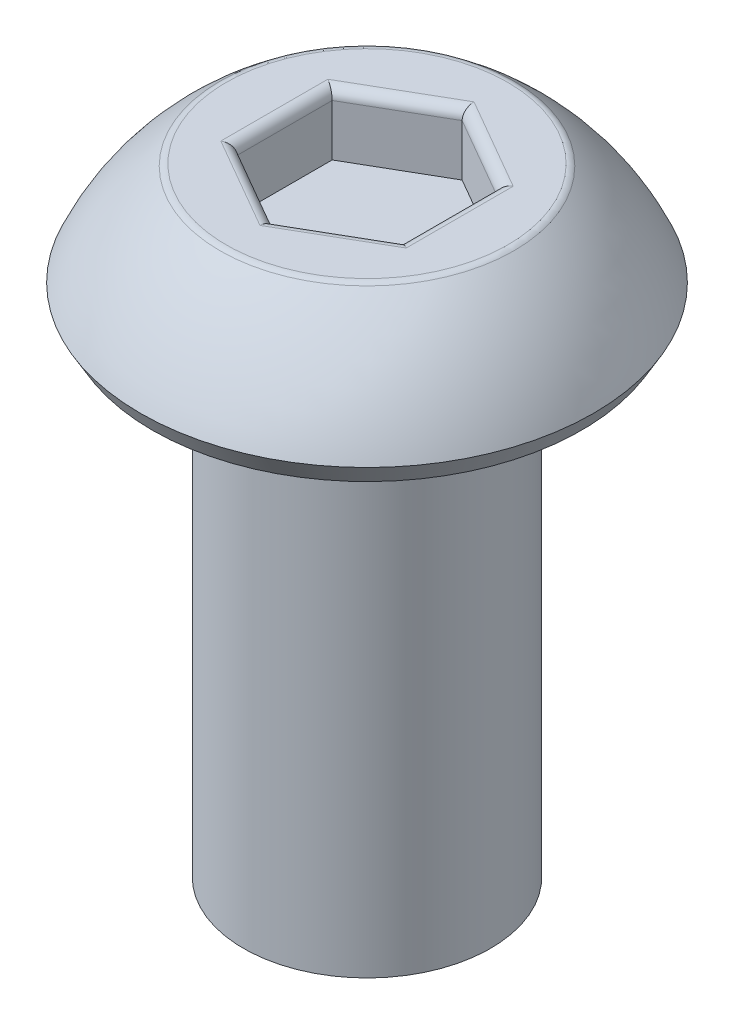
ISO-10303-21;
HEADER;
FILE_DESCRIPTION(('STEP AP214'),'2;1');
FILE_NAME('part.step','',(''),(''),'','','');
FILE_SCHEMA(('AUTOMOTIVE_DESIGN { 1 0 10303 214 1 1 1 1 }'));
ENDSEC;
DATA;
#1=APPLICATION_CONTEXT('core data for automotive mechanical design processes');
#2=APPLICATION_PROTOCOL_DEFINITION('international standard','automotive_design',2000,#1);
#3=PRODUCT_CONTEXT('',#1,'mechanical');
#4=PRODUCT('Part','Part','',(#3));
#5=PRODUCT_RELATED_PRODUCT_CATEGORY('part','',(#4));
#6=PRODUCT_DEFINITION_FORMATION('','',#4);
#7=PRODUCT_DEFINITION_CONTEXT('part definition',#1,'design');
#8=PRODUCT_DEFINITION('design','',#6,#7);
#9=PRODUCT_DEFINITION_SHAPE('','',#8);
#10=(LENGTH_UNIT() NAMED_UNIT(*) SI_UNIT(.MILLI.,.METRE.));
#11=(NAMED_UNIT(*) PLANE_ANGLE_UNIT() SI_UNIT($,.RADIAN.));
#12=(NAMED_UNIT(*) SI_UNIT($,.STERADIAN.) SOLID_ANGLE_UNIT());
#13=UNCERTAINTY_MEASURE_WITH_UNIT(LENGTH_MEASURE(1.E-05),#10,'distance_accuracy_value','');
#14=(GEOMETRIC_REPRESENTATION_CONTEXT(3) GLOBAL_UNCERTAINTY_ASSIGNED_CONTEXT((#13)) GLOBAL_UNIT_ASSIGNED_CONTEXT((#10,
#11,#12)) REPRESENTATION_CONTEXT('',''));
#15=CARTESIAN_POINT('',(0.,0.,0.));
#16=DIRECTION('',(0.,0.,1.));
#17=DIRECTION('',(1.,0.,0.));
#18=AXIS2_PLACEMENT_3D('',#15,#16,#17);
#19=CARTESIAN_POINT('',(0.,1.5,0.));
#20=DIRECTION('',(0.,-1.,0.));
#21=DIRECTION('',(0.,0.,-1.));
#22=AXIS2_PLACEMENT_3D('',#19,#20,#21);
#23=PLANE('',#22);
#24=CARTESIAN_POINT('',(0.,1.5,0.));
#25=DIRECTION('',(0.,-1.,0.));
#26=DIRECTION('',(0.,0.,-1.));
#27=AXIS2_PLACEMENT_3D('',#24,#25,#26);
#28=CIRCLE('',#27,1.70906948191647);
#29=CARTESIAN_POINT('',(0.,1.5,-1.70906948191647));
#30=VERTEX_POINT('',#29);
#31=EDGE_CURVE('E179',#30,#30,#28,.F.);
#32=ORIENTED_EDGE('',*,*,#31,.T.);
#33=EDGE_LOOP('',(#32));
#34=FACE_BOUND('',#33,.T.);
#35=DIRECTION('',(0.866025403784439,0.,-0.5));
#36=VECTOR('',#35,1.);
#37=CARTESIAN_POINT('',(0.5625,1.5,0.974278579257493));
#38=LINE('',#37,#36);
#39=CARTESIAN_POINT('',(1.125,1.5,0.649519052838329));
#40=VERTEX_POINT('',#39);
#41=CARTESIAN_POINT('',(0.,1.5,1.29903810567666));
#42=VERTEX_POINT('',#41);
#43=EDGE_CURVE('E174',#40,#42,#38,.F.);
#44=ORIENTED_EDGE('',*,*,#43,.T.);
#45=DIRECTION('',(0.866025403784439,0.,0.5));
#46=VECTOR('',#45,1.);
#47=CARTESIAN_POINT('',(-0.5625,1.5,0.974278579257493));
#48=LINE('',#47,#46);
#49=CARTESIAN_POINT('',(-1.125,1.5,0.649519052838329));
#50=VERTEX_POINT('',#49);
#51=EDGE_CURVE('E176',#42,#50,#48,.F.);
#52=ORIENTED_EDGE('',*,*,#51,.T.);
#53=DIRECTION('',(0.,0.,1.));
#54=VECTOR('',#53,1.);
#55=CARTESIAN_POINT('',(-1.125,1.5,0.));
#56=LINE('',#55,#54);
#57=CARTESIAN_POINT('',(-1.125,1.5,-0.649519052838329));
#58=VERTEX_POINT('',#57);
#59=EDGE_CURVE('E166',#50,#58,#56,.F.);
#60=ORIENTED_EDGE('',*,*,#59,.T.);
#61=DIRECTION('',(-0.866025403784439,0.,0.5));
#62=VECTOR('',#61,1.);
#63=CARTESIAN_POINT('',(-0.5625,1.5,-0.974278579257493));
#64=LINE('',#63,#62);
#65=CARTESIAN_POINT('',(0.,1.5,-1.29903810567666));
#66=VERTEX_POINT('',#65);
#67=EDGE_CURVE('E168',#58,#66,#64,.F.);
#68=ORIENTED_EDGE('',*,*,#67,.T.);
#69=DIRECTION('',(-0.866025403784439,0.,-0.5));
#70=VECTOR('',#69,1.);
#71=CARTESIAN_POINT('',(0.5625,1.5,-0.974278579257494));
#72=LINE('',#71,#70);
#73=CARTESIAN_POINT('',(1.125,1.5,-0.64951905283833));
#74=VERTEX_POINT('',#73);
#75=EDGE_CURVE('E170',#66,#74,#72,.F.);
#76=ORIENTED_EDGE('',*,*,#75,.T.);
#77=DIRECTION('',(0.,0.,-1.));
#78=VECTOR('',#77,1.);
#79=CARTESIAN_POINT('',(1.125,1.5,0.));
#80=LINE('',#79,#78);
#81=EDGE_CURVE('E172',#74,#40,#80,.F.);
#82=ORIENTED_EDGE('',*,*,#81,.T.);
#83=EDGE_LOOP('',(#44,#52,#60,#68,#76,#82));
#84=FACE_BOUND('',#83,.T.);
#85=ADVANCED_FACE('F37',(#34,#84),#23,.F.);
#86=CARTESIAN_POINT('',(0.,-0.931154789034212,0.));
#87=DIRECTION('',(0.,-1.,0.));
#88=DIRECTION('',(0.,0.,-1.));
#89=AXIS2_PLACEMENT_3D('',#86,#87,#88);
#90=DEGENERATE_TOROIDAL_SURFACE('',#89,0.00769348629276519,3.,.F.);
#91=CARTESIAN_POINT('',(0.,1.47526759952323,0.));
#92=DIRECTION('',(0.,-1.,0.));
#93=DIRECTION('',(0.,0.,-1.));
#94=AXIS2_PLACEMENT_3D('',#91,#92,#93);
#95=CIRCLE('',#94,1.78371135009948);
#96=CARTESIAN_POINT('',(0.,1.47526759952323,-1.78371135009948));
#97=VERTEX_POINT('',#96);
#98=EDGE_CURVE('E163',#97,#97,#95,.T.);
#99=ORIENTED_EDGE('',*,*,#98,.T.);
#100=EDGE_LOOP('',(#99));
#101=FACE_BOUND('',#100,.T.);
#102=CARTESIAN_POINT('',(0.,0.25,0.));
#103=DIRECTION('',(0.,-1.,0.));
#104=DIRECTION('',(0.,0.,-1.));
#105=AXIS2_PLACEMENT_3D('',#102,#103,#104);
#106=CIRCLE('',#105,2.75);
#107=CARTESIAN_POINT('',(0.,0.25,-2.75));
#108=VERTEX_POINT('',#107);
#109=EDGE_CURVE('E160',#108,#108,#106,.T.);
#110=ORIENTED_EDGE('',*,*,#109,.F.);
#111=EDGE_LOOP('',(#110));
#112=FACE_BOUND('',#111,.T.);
#113=ADVANCED_FACE('F246',(#101,#112),#90,.F.);
#114=CARTESIAN_POINT('',(0.,0.25,0.));
#115=DIRECTION('',(0.,1.,0.));
#116=DIRECTION('',(0.,0.,1.));
#117=AXIS2_PLACEMENT_3D('',#114,#115,#116);
#118=CONICAL_SURFACE('',#117,2.75,0.523598775598296);
#119=CARTESIAN_POINT('',(0.,0.,0.));
#120=DIRECTION('',(0.,-1.,0.));
#121=DIRECTION('',(0.,0.,-1.));
#122=AXIS2_PLACEMENT_3D('',#119,#120,#121);
#123=CIRCLE('',#122,2.60566243270259);
#124=CARTESIAN_POINT('',(0.,0.,-2.60566243270259));
#125=VERTEX_POINT('',#124);
#126=EDGE_CURVE('E157',#125,#125,#123,.T.);
#127=ORIENTED_EDGE('',*,*,#126,.F.);
#128=EDGE_LOOP('',(#127));
#129=FACE_BOUND('',#128,.T.);
#130=ORIENTED_EDGE('',*,*,#109,.T.);
#131=EDGE_LOOP('',(#130));
#132=FACE_BOUND('',#131,.T.);
#133=ADVANCED_FACE('F252',(#129,#132),#118,.T.);
#134=CARTESIAN_POINT('',(0.,0.,2.60566243270259));
#135=DIRECTION('',(0.,1.,0.));
#136=DIRECTION('',(0.,0.,1.));
#137=AXIS2_PLACEMENT_3D('',#134,#135,#136);
#138=PLANE('',#137);
#139=CARTESIAN_POINT('',(0.,0.,0.));
#140=DIRECTION('',(0.,-1.,0.));
#141=DIRECTION('',(0.,0.,-1.));
#142=AXIS2_PLACEMENT_3D('',#139,#140,#141);
#143=CIRCLE('',#142,1.5);
#144=CARTESIAN_POINT('',(0.,0.,-1.5));
#145=VERTEX_POINT('',#144);
#146=EDGE_CURVE('E154',#145,#145,#143,.T.);
#147=ORIENTED_EDGE('',*,*,#146,.F.);
#148=EDGE_LOOP('',(#147));
#149=FACE_BOUND('',#148,.T.);
#150=ORIENTED_EDGE('',*,*,#126,.T.);
#151=EDGE_LOOP('',(#150));
#152=FACE_BOUND('',#151,.T.);
#153=ADVANCED_FACE('F271',(#149,#152),#138,.F.);
#154=CARTESIAN_POINT('',(0.,-6.,0.));
#155=DIRECTION('',(0.,-1.,0.));
#156=DIRECTION('',(0.,0.,-1.));
#157=AXIS2_PLACEMENT_3D('',#154,#155,#156);
#158=CYLINDRICAL_SURFACE('',#157,1.5);
#159=CARTESIAN_POINT('',(0.,-6.,0.));
#160=DIRECTION('',(0.,-1.,0.));
#161=DIRECTION('',(0.,0.,-1.));
#162=AXIS2_PLACEMENT_3D('',#159,#160,#161);
#163=CIRCLE('',#162,1.5);
#164=CARTESIAN_POINT('',(0.,-6.,-1.5));
#165=VERTEX_POINT('',#164);
#166=EDGE_CURVE('E141',#165,#165,#163,.T.);
#167=ORIENTED_EDGE('',*,*,#166,.F.);
#168=EDGE_LOOP('',(#167));
#169=FACE_BOUND('',#168,.T.);
#170=ORIENTED_EDGE('',*,*,#146,.T.);
#171=EDGE_LOOP('',(#170));
#172=FACE_BOUND('',#171,.T.);
#173=ADVANCED_FACE('F276',(#169,#172),#158,.T.);
#174=CARTESIAN_POINT('',(0.,-6.,1.5));
#175=DIRECTION('',(0.,1.,0.));
#176=DIRECTION('',(0.,0.,1.));
#177=AXIS2_PLACEMENT_3D('',#174,#175,#176);
#178=PLANE('',#177);
#179=ORIENTED_EDGE('',*,*,#166,.T.);
#180=EDGE_LOOP('',(#179));
#181=FACE_BOUND('',#180,.T.);
#182=ADVANCED_FACE('F283',(#181),#178,.F.);
#183=CARTESIAN_POINT('',(0.999999999999999,0.75,-0.577350269189626));
#184=DIRECTION('',(0.5,0.,-0.866025403784439));
#185=DIRECTION('',(-0.866025403784439,0.,-0.5));
#186=AXIS2_PLACEMENT_3D('',#183,#184,#185);
#187=PLANE('',#186);
#188=DIRECTION('',(0.,1.,0.));
#189=VECTOR('',#188,1.);
#190=CARTESIAN_POINT('',(0.999999999999999,0.75,-0.577350269189626));
#191=LINE('',#190,#189);
#192=CARTESIAN_POINT('',(0.999999999999999,0.75,-0.577350269189626));
#193=VERTEX_POINT('',#192);
#194=CARTESIAN_POINT('',(0.999999999999999,1.375,-0.577350269189626));
#195=VERTEX_POINT('',#194);
#196=EDGE_CURVE('E139',#193,#195,#191,.T.);
#197=ORIENTED_EDGE('',*,*,#196,.T.);
#198=DIRECTION('',(-0.866025403784439,0.,-0.5));
#199=VECTOR('',#198,1.);
#200=CARTESIAN_POINT('',(0.999999999999999,1.375,-0.577350269189626));
#201=LINE('',#200,#199);
#202=CARTESIAN_POINT('',(0.,1.375,-1.15470053837925));
#203=VERTEX_POINT('',#202);
#204=EDGE_CURVE('E61',#195,#203,#201,.T.);
#205=ORIENTED_EDGE('',*,*,#204,.T.);
#206=DIRECTION('',(0.,1.,0.));
#207=VECTOR('',#206,1.);
#208=CARTESIAN_POINT('',(0.,0.75,-1.15470053837925));
#209=LINE('',#208,#207);
#210=CARTESIAN_POINT('',(0.,0.75,-1.15470053837925));
#211=VERTEX_POINT('',#210);
#212=EDGE_CURVE('E107',#211,#203,#209,.T.);
#213=ORIENTED_EDGE('',*,*,#212,.F.);
#214=DIRECTION('',(-0.866025403784439,0.,-0.5));
#215=VECTOR('',#214,1.);
#216=CARTESIAN_POINT('',(0.999999999999999,0.75,-0.577350269189626));
#217=LINE('',#216,#215);
#218=EDGE_CURVE('E111',#193,#211,#217,.T.);
#219=ORIENTED_EDGE('',*,*,#218,.F.);
#220=EDGE_LOOP('',(#197,#205,#213,#219));
#221=FACE_BOUND('',#220,.T.);
#222=ADVANCED_FACE('F109',(#221),#187,.F.);
#223=CARTESIAN_POINT('',(1.,0.75,0.577350269189626));
#224=DIRECTION('',(1.,0.,0.));
#225=DIRECTION('',(0.,0.,-1.));
#226=AXIS2_PLACEMENT_3D('',#223,#224,#225);
#227=PLANE('',#226);
#228=DIRECTION('',(0.,1.,0.));
#229=VECTOR('',#228,1.);
#230=CARTESIAN_POINT('',(1.,0.75,0.577350269189626));
#231=LINE('',#230,#229);
#232=CARTESIAN_POINT('',(1.,0.75,0.577350269189626));
#233=VERTEX_POINT('',#232);
#234=CARTESIAN_POINT('',(1.,1.375,0.577350269189626));
#235=VERTEX_POINT('',#234);
#236=EDGE_CURVE('E142',#233,#235,#231,.T.);
#237=ORIENTED_EDGE('',*,*,#236,.T.);
#238=DIRECTION('',(0.,0.,-1.));
#239=VECTOR('',#238,1.);
#240=CARTESIAN_POINT('',(1.,1.375,0.577350269189626));
#241=LINE('',#240,#239);
#242=EDGE_CURVE('E187',#235,#195,#241,.T.);
#243=ORIENTED_EDGE('',*,*,#242,.T.);
#244=ORIENTED_EDGE('',*,*,#196,.F.);
#245=DIRECTION('',(0.,0.,-1.));
#246=VECTOR('',#245,1.);
#247=CARTESIAN_POINT('',(1.,0.75,0.577350269189626));
#248=LINE('',#247,#246);
#249=EDGE_CURVE('E115',#233,#193,#248,.T.);
#250=ORIENTED_EDGE('',*,*,#249,.F.);
#251=EDGE_LOOP('',(#237,#243,#244,#250));
#252=FACE_BOUND('',#251,.T.);
#253=ADVANCED_FACE('F227',(#252),#227,.F.);
#254=CARTESIAN_POINT('',(0.,0.75,1.15470053837925));
#255=DIRECTION('',(0.5,0.,0.866025403784439));
#256=DIRECTION('',(0.866025403784439,0.,-0.5));
#257=AXIS2_PLACEMENT_3D('',#254,#255,#256);
#258=PLANE('',#257);
#259=DIRECTION('',(0.,1.,0.));
#260=VECTOR('',#259,1.);
#261=CARTESIAN_POINT('',(0.,0.75,1.15470053837925));
#262=LINE('',#261,#260);
#263=CARTESIAN_POINT('',(0.,0.75,1.15470053837925));
#264=VERTEX_POINT('',#263);
#265=CARTESIAN_POINT('',(0.,1.375,1.15470053837925));
#266=VERTEX_POINT('',#265);
#267=EDGE_CURVE('E145',#264,#266,#262,.T.);
#268=ORIENTED_EDGE('',*,*,#267,.T.);
#269=DIRECTION('',(0.866025403784439,0.,-0.5));
#270=VECTOR('',#269,1.);
#271=CARTESIAN_POINT('',(0.,1.375,1.15470053837925));
#272=LINE('',#271,#270);
#273=EDGE_CURVE('E185',#266,#235,#272,.T.);
#274=ORIENTED_EDGE('',*,*,#273,.T.);
#275=ORIENTED_EDGE('',*,*,#236,.F.);
#276=DIRECTION('',(0.866025403784439,0.,-0.5));
#277=VECTOR('',#276,1.);
#278=CARTESIAN_POINT('',(0.,0.75,1.15470053837925));
#279=LINE('',#278,#277);
#280=EDGE_CURVE('E136',#264,#233,#279,.T.);
#281=ORIENTED_EDGE('',*,*,#280,.F.);
#282=EDGE_LOOP('',(#268,#274,#275,#281));
#283=FACE_BOUND('',#282,.T.);
#284=ADVANCED_FACE('F228',(#283),#258,.F.);
#285=CARTESIAN_POINT('',(-0.999999999999999,0.75,0.577350269189626));
#286=DIRECTION('',(-0.5,0.,0.866025403784439));
#287=DIRECTION('',(0.866025403784439,0.,0.5));
#288=AXIS2_PLACEMENT_3D('',#285,#286,#287);
#289=PLANE('',#288);
#290=DIRECTION('',(0.,1.,0.));
#291=VECTOR('',#290,1.);
#292=CARTESIAN_POINT('',(-0.999999999999999,0.75,0.577350269189626));
#293=LINE('',#292,#291);
#294=CARTESIAN_POINT('',(-0.999999999999999,0.75,0.577350269189626));
#295=VERTEX_POINT('',#294);
#296=CARTESIAN_POINT('',(-0.999999999999999,1.375,0.577350269189626));
#297=VERTEX_POINT('',#296);
#298=EDGE_CURVE('E148',#295,#297,#293,.T.);
#299=ORIENTED_EDGE('',*,*,#298,.T.);
#300=DIRECTION('',(0.866025403784439,0.,0.5));
#301=VECTOR('',#300,1.);
#302=CARTESIAN_POINT('',(-0.999999999999999,1.375,0.577350269189626));
#303=LINE('',#302,#301);
#304=EDGE_CURVE('E182',#297,#266,#303,.T.);
#305=ORIENTED_EDGE('',*,*,#304,.T.);
#306=ORIENTED_EDGE('',*,*,#267,.F.);
#307=DIRECTION('',(0.866025403784439,0.,0.5));
#308=VECTOR('',#307,1.);
#309=CARTESIAN_POINT('',(-0.999999999999999,0.75,0.577350269189626));
#310=LINE('',#309,#308);
#311=EDGE_CURVE('E133',#295,#264,#310,.T.);
#312=ORIENTED_EDGE('',*,*,#311,.F.);
#313=EDGE_LOOP('',(#299,#305,#306,#312));
#314=FACE_BOUND('',#313,.T.);
#315=ADVANCED_FACE('F223',(#314),#289,.F.);
#316=CARTESIAN_POINT('',(-1.,0.75,-0.577350269189626));
#317=DIRECTION('',(-1.,0.,0.));
#318=DIRECTION('',(0.,0.,1.));
#319=AXIS2_PLACEMENT_3D('',#316,#317,#318);
#320=PLANE('',#319);
#321=DIRECTION('',(0.,1.,0.));
#322=VECTOR('',#321,1.);
#323=CARTESIAN_POINT('',(-1.,0.75,-0.577350269189626));
#324=LINE('',#323,#322);
#325=CARTESIAN_POINT('',(-1.,0.75,-0.577350269189626));
#326=VERTEX_POINT('',#325);
#327=CARTESIAN_POINT('',(-1.,1.375,-0.577350269189626));
#328=VERTEX_POINT('',#327);
#329=EDGE_CURVE('E114',#326,#328,#324,.T.);
#330=ORIENTED_EDGE('',*,*,#329,.T.);
#331=DIRECTION('',(0.,0.,1.));
#332=VECTOR('',#331,1.);
#333=CARTESIAN_POINT('',(-1.,1.375,-0.577350269189626));
#334=LINE('',#333,#332);
#335=EDGE_CURVE('E11',#328,#297,#334,.T.);
#336=ORIENTED_EDGE('',*,*,#335,.T.);
#337=ORIENTED_EDGE('',*,*,#298,.F.);
#338=DIRECTION('',(0.,0.,1.));
#339=VECTOR('',#338,1.);
#340=CARTESIAN_POINT('',(-1.,0.75,-0.577350269189626));
#341=LINE('',#340,#339);
#342=EDGE_CURVE('E123',#326,#295,#341,.T.);
#343=ORIENTED_EDGE('',*,*,#342,.F.);
#344=EDGE_LOOP('',(#330,#336,#337,#343));
#345=FACE_BOUND('',#344,.T.);
#346=ADVANCED_FACE('F220',(#345),#320,.F.);
#347=CARTESIAN_POINT('',(0.,0.75,-1.15470053837925));
#348=DIRECTION('',(-0.5,0.,-0.866025403784438));
#349=DIRECTION('',(-0.866025403784439,0.,0.5));
#350=AXIS2_PLACEMENT_3D('',#347,#348,#349);
#351=PLANE('',#350);
#352=ORIENTED_EDGE('',*,*,#212,.T.);
#353=DIRECTION('',(-0.866025403784439,0.,0.5));
#354=VECTOR('',#353,1.);
#355=CARTESIAN_POINT('',(0.,1.375,-1.15470053837925));
#356=LINE('',#355,#354);
#357=EDGE_CURVE('E46',#203,#328,#356,.T.);
#358=ORIENTED_EDGE('',*,*,#357,.T.);
#359=ORIENTED_EDGE('',*,*,#329,.F.);
#360=DIRECTION('',(-0.866025403784439,0.,0.5));
#361=VECTOR('',#360,1.);
#362=CARTESIAN_POINT('',(0.,0.75,-1.15470053837925));
#363=LINE('',#362,#361);
#364=EDGE_CURVE('E118',#211,#326,#363,.T.);
#365=ORIENTED_EDGE('',*,*,#364,.F.);
#366=EDGE_LOOP('',(#352,#358,#359,#365));
#367=FACE_BOUND('',#366,.T.);
#368=ADVANCED_FACE('F119',(#367),#351,.F.);
#369=CARTESIAN_POINT('',(0.,0.75,0.));
#370=DIRECTION('',(0.,1.,0.));
#371=DIRECTION('',(0.,0.,1.));
#372=AXIS2_PLACEMENT_3D('',#369,#370,#371);
#373=PLANE('',#372);
#374=ORIENTED_EDGE('',*,*,#218,.T.);
#375=ORIENTED_EDGE('',*,*,#364,.T.);
#376=ORIENTED_EDGE('',*,*,#342,.T.);
#377=ORIENTED_EDGE('',*,*,#311,.T.);
#378=ORIENTED_EDGE('',*,*,#280,.T.);
#379=ORIENTED_EDGE('',*,*,#249,.T.);
#380=EDGE_LOOP('',(#374,#375,#376,#377,#378,#379));
#381=FACE_BOUND('',#380,.T.);
#382=ADVANCED_FACE('F125',(#381),#373,.T.);
#383=CARTESIAN_POINT('',(0.,1.375,0.));
#384=DIRECTION('',(0.,-1.,0.));
#385=DIRECTION('',(0.,0.,-1.));
#386=AXIS2_PLACEMENT_3D('',#383,#384,#385);
#387=TOROIDAL_SURFACE('',#386,1.70906948191647,0.125);
#388=ORIENTED_EDGE('',*,*,#31,.F.);
#389=EDGE_LOOP('',(#388));
#390=FACE_BOUND('',#389,.T.);
#391=ORIENTED_EDGE('',*,*,#98,.F.);
#392=EDGE_LOOP('',(#391));
#393=FACE_BOUND('',#392,.T.);
#394=ADVANCED_FACE('F256',(#390,#393),#387,.T.);
#395=CARTESIAN_POINT('',(1.0625,1.375,-0.685603444662681));
#396=DIRECTION('',(-0.866025403784439,0.,-0.5));
#397=DIRECTION('',(-0.5,0.,0.866025403784439));
#398=AXIS2_PLACEMENT_3D('',#395,#396,#397);
#399=CYLINDRICAL_SURFACE('',#398,0.125);
#400=CARTESIAN_POINT('',(1.125,1.375,-0.64951905283833));
#401=DIRECTION('',(-0.5,0.,-0.866025403784438));
#402=DIRECTION('',(0.866025403784439,0.,-0.5));
#403=AXIS2_PLACEMENT_3D('',#400,#401,#402);
#404=ELLIPSE('',#403,0.144337567297406,0.125);
#405=EDGE_CURVE('E130',#74,#195,#404,.F.);
#406=ORIENTED_EDGE('',*,*,#405,.F.);
#407=ORIENTED_EDGE('',*,*,#75,.F.);
#408=CARTESIAN_POINT('',(0.,1.375,-1.29903810567666));
#409=DIRECTION('',(-1.,0.,0.));
#410=DIRECTION('',(0.,0.,-1.));
#411=AXIS2_PLACEMENT_3D('',#408,#409,#410);
#412=ELLIPSE('',#411,0.144337567297406,0.125);
#413=EDGE_CURVE('E41',#203,#66,#412,.T.);
#414=ORIENTED_EDGE('',*,*,#413,.F.);
#415=ORIENTED_EDGE('',*,*,#204,.F.);
#416=EDGE_LOOP('',(#406,#407,#414,#415));
#417=FACE_BOUND('',#416,.T.);
#418=ADVANCED_FACE('F39',(#417),#399,.T.);
#419=CARTESIAN_POINT('',(-0.0625000000000002,1.375,-1.26295371385231));
#420=DIRECTION('',(-0.866025403784439,0.,0.5));
#421=DIRECTION('',(0.5,0.,0.866025403784439));
#422=AXIS2_PLACEMENT_3D('',#419,#420,#421);
#423=CYLINDRICAL_SURFACE('',#422,0.125);
#424=ORIENTED_EDGE('',*,*,#413,.T.);
#425=ORIENTED_EDGE('',*,*,#67,.F.);
#426=CARTESIAN_POINT('',(-1.125,1.375,-0.649519052838329));
#427=DIRECTION('',(-0.5,0.,0.866025403784439));
#428=DIRECTION('',(-0.866025403784439,0.,-0.5));
#429=AXIS2_PLACEMENT_3D('',#426,#427,#428);
#430=ELLIPSE('',#429,0.144337567297406,0.125);
#431=EDGE_CURVE('E198',#328,#58,#430,.T.);
#432=ORIENTED_EDGE('',*,*,#431,.F.);
#433=ORIENTED_EDGE('',*,*,#357,.F.);
#434=EDGE_LOOP('',(#424,#425,#432,#433));
#435=FACE_BOUND('',#434,.T.);
#436=ADVANCED_FACE('F212',(#435),#423,.T.);
#437=CARTESIAN_POINT('',(1.125,1.375,0.577350269189626));
#438=DIRECTION('',(0.,0.,-1.));
#439=DIRECTION('',(-1.,0.,0.));
#440=AXIS2_PLACEMENT_3D('',#437,#438,#439);
#441=CYLINDRICAL_SURFACE('',#440,0.125);
#442=ORIENTED_EDGE('',*,*,#405,.T.);
#443=ORIENTED_EDGE('',*,*,#242,.F.);
#444=CARTESIAN_POINT('',(1.125,1.375,0.649519052838329));
#445=DIRECTION('',(0.5,0.,-0.866025403784439));
#446=DIRECTION('',(0.866025403784439,0.,0.5));
#447=AXIS2_PLACEMENT_3D('',#444,#445,#446);
#448=ELLIPSE('',#447,0.144337567297406,0.125);
#449=EDGE_CURVE('E195',#40,#235,#448,.F.);
#450=ORIENTED_EDGE('',*,*,#449,.F.);
#451=ORIENTED_EDGE('',*,*,#81,.F.);
#452=EDGE_LOOP('',(#442,#443,#450,#451));
#453=FACE_BOUND('',#452,.T.);
#454=ADVANCED_FACE('F205',(#453),#441,.T.);
#455=CARTESIAN_POINT('',(-1.125,1.375,-0.577350269189626));
#456=DIRECTION('',(0.,0.,1.));
#457=DIRECTION('',(1.,0.,0.));
#458=AXIS2_PLACEMENT_3D('',#455,#456,#457);
#459=CYLINDRICAL_SURFACE('',#458,0.125);
#460=ORIENTED_EDGE('',*,*,#431,.T.);
#461=ORIENTED_EDGE('',*,*,#59,.F.);
#462=CARTESIAN_POINT('',(-1.125,1.375,0.649519052838329));
#463=DIRECTION('',(0.5,0.,0.866025403784438));
#464=DIRECTION('',(0.866025403784439,0.,-0.5));
#465=AXIS2_PLACEMENT_3D('',#462,#463,#464);
#466=ELLIPSE('',#465,0.144337567297406,0.125);
#467=EDGE_CURVE('E193',#297,#50,#466,.T.);
#468=ORIENTED_EDGE('',*,*,#467,.F.);
#469=ORIENTED_EDGE('',*,*,#335,.F.);
#470=EDGE_LOOP('',(#460,#461,#468,#469));
#471=FACE_BOUND('',#470,.T.);
#472=ADVANCED_FACE('F217',(#471),#459,.T.);
#473=CARTESIAN_POINT('',(0.0625000000000004,1.375,1.26295371385231));
#474=DIRECTION('',(0.866025403784439,0.,-0.5));
#475=DIRECTION('',(-0.5,0.,-0.866025403784439));
#476=AXIS2_PLACEMENT_3D('',#473,#474,#475);
#477=CYLINDRICAL_SURFACE('',#476,0.125);
#478=ORIENTED_EDGE('',*,*,#449,.T.);
#479=ORIENTED_EDGE('',*,*,#273,.F.);
#480=CARTESIAN_POINT('',(0.,1.375,1.29903810567666));
#481=DIRECTION('',(1.,0.,0.));
#482=DIRECTION('',(0.,0.,1.));
#483=AXIS2_PLACEMENT_3D('',#480,#481,#482);
#484=ELLIPSE('',#483,0.144337567297406,0.125);
#485=EDGE_CURVE('E191',#42,#266,#484,.F.);
#486=ORIENTED_EDGE('',*,*,#485,.F.);
#487=ORIENTED_EDGE('',*,*,#43,.F.);
#488=EDGE_LOOP('',(#478,#479,#486,#487));
#489=FACE_BOUND('',#488,.T.);
#490=ADVANCED_FACE('F232',(#489),#477,.T.);
#491=CARTESIAN_POINT('',(-1.0625,1.375,0.685603444662681));
#492=DIRECTION('',(0.866025403784439,0.,0.5));
#493=DIRECTION('',(0.5,0.,-0.866025403784439));
#494=AXIS2_PLACEMENT_3D('',#491,#492,#493);
#495=CYLINDRICAL_SURFACE('',#494,0.125);
#496=ORIENTED_EDGE('',*,*,#467,.T.);
#497=ORIENTED_EDGE('',*,*,#51,.F.);
#498=ORIENTED_EDGE('',*,*,#485,.T.);
#499=ORIENTED_EDGE('',*,*,#304,.F.);
#500=EDGE_LOOP('',(#496,#497,#498,#499));
#501=FACE_BOUND('',#500,.T.);
#502=ADVANCED_FACE('F237',(#501),#495,.T.);
#503=CLOSED_SHELL('',(#85,#113,#133,#153,#173,#182,#222,#253,#284,#315,#346,#368,#382,#394,#418,
#436,#454,#472,#490,#502));
#504=MANIFOLD_SOLID_BREP('B2',#503);
#505=ADVANCED_BREP_SHAPE_REPRESENTATION('',(#18,#504),#14);
#506=SHAPE_DEFINITION_REPRESENTATION(#9,#505);
ENDSEC;
END-ISO-10303-21;
